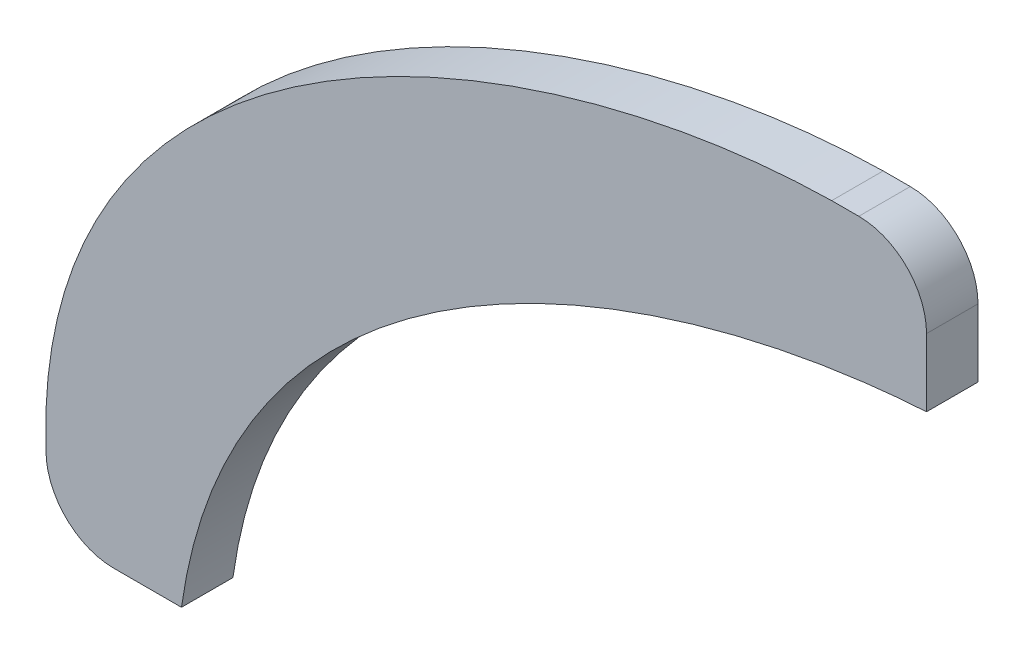
ISO-10303-21;
HEADER;
FILE_DESCRIPTION(('STEP AP214'),'2;1');
FILE_NAME('part.step','',(''),(''),'','','');
FILE_SCHEMA(('AUTOMOTIVE_DESIGN { 1 0 10303 214 1 1 1 1 }'));
ENDSEC;
DATA;
#1=APPLICATION_CONTEXT('core data for automotive mechanical design processes');
#2=APPLICATION_PROTOCOL_DEFINITION('international standard','automotive_design',2000,#1);
#3=PRODUCT_CONTEXT('',#1,'mechanical');
#4=PRODUCT('Part','Part','',(#3));
#5=PRODUCT_RELATED_PRODUCT_CATEGORY('part','',(#4));
#6=PRODUCT_DEFINITION_FORMATION('','',#4);
#7=PRODUCT_DEFINITION_CONTEXT('part definition',#1,'design');
#8=PRODUCT_DEFINITION('design','',#6,#7);
#9=PRODUCT_DEFINITION_SHAPE('','',#8);
#10=(LENGTH_UNIT() NAMED_UNIT(*) SI_UNIT(.MILLI.,.METRE.));
#11=(NAMED_UNIT(*) PLANE_ANGLE_UNIT() SI_UNIT($,.RADIAN.));
#12=(NAMED_UNIT(*) SI_UNIT($,.STERADIAN.) SOLID_ANGLE_UNIT());
#13=UNCERTAINTY_MEASURE_WITH_UNIT(LENGTH_MEASURE(1.E-05),#10,'distance_accuracy_value','');
#14=(GEOMETRIC_REPRESENTATION_CONTEXT(3) GLOBAL_UNCERTAINTY_ASSIGNED_CONTEXT((#13)) GLOBAL_UNIT_ASSIGNED_CONTEXT((#10,
#11,#12)) REPRESENTATION_CONTEXT('',''));
#15=CARTESIAN_POINT('',(0.,0.,0.));
#16=DIRECTION('',(0.,0.,1.));
#17=DIRECTION('',(1.,0.,0.));
#18=AXIS2_PLACEMENT_3D('',#15,#16,#17);
#19=CARTESIAN_POINT('',(0.,0.,4.826));
#20=DIRECTION('',(0.,1.,0.));
#21=DIRECTION('',(0.,0.,1.));
#22=AXIS2_PLACEMENT_3D('',#19,#20,#21);
#23=PLANE('',#22);
#24=DIRECTION('',(1.,0.,0.));
#25=VECTOR('',#24,1.);
#26=CARTESIAN_POINT('',(0.,0.,0.));
#27=LINE('',#26,#25);
#28=CARTESIAN_POINT('',(6.35000000000004,0.,0.));
#29=VERTEX_POINT('',#28);
#30=CARTESIAN_POINT('',(12.7,0.,0.));
#31=VERTEX_POINT('',#30);
#32=EDGE_CURVE('E132',#29,#31,#27,.T.);
#33=ORIENTED_EDGE('',*,*,#32,.T.);
#34=DIRECTION('',(0.,0.,-1.));
#35=VECTOR('',#34,1.);
#36=CARTESIAN_POINT('',(12.7,0.,4.826));
#37=LINE('',#36,#35);
#38=CARTESIAN_POINT('',(12.7,0.,4.826));
#39=VERTEX_POINT('',#38);
#40=EDGE_CURVE('E11',#39,#31,#37,.T.);
#41=ORIENTED_EDGE('',*,*,#40,.F.);
#42=DIRECTION('',(1.,0.,0.));
#43=VECTOR('',#42,1.);
#44=CARTESIAN_POINT('',(0.,0.,4.826));
#45=LINE('',#44,#43);
#46=CARTESIAN_POINT('',(6.35000000000004,0.,4.826));
#47=VERTEX_POINT('',#46);
#48=EDGE_CURVE('E159',#47,#39,#45,.T.);
#49=ORIENTED_EDGE('',*,*,#48,.F.);
#50=DIRECTION('',(0.,0.,-1.));
#51=VECTOR('',#50,1.);
#52=CARTESIAN_POINT('',(6.35000000000004,0.,4.826));
#53=LINE('',#52,#51);
#54=EDGE_CURVE('E125',#47,#29,#53,.T.);
#55=ORIENTED_EDGE('',*,*,#54,.T.);
#56=EDGE_LOOP('',(#33,#41,#49,#55));
#57=FACE_BOUND('',#56,.T.);
#58=ADVANCED_FACE('F35',(#57),#23,.F.);
#59=CARTESIAN_POINT('',(12.7,0.,4.826));
#60=CARTESIAN_POINT('',(17.2634900985718,32.9463909990225,4.826));
#61=CARTESIAN_POINT('',(53.333433175002,49.0331917131884,4.826));
#62=CARTESIAN_POINT('',(82.55,50.8,4.826));
#63=B_SPLINE_CURVE_WITH_KNOTS('',3,(#59,#60,#61,#62),.UNSPECIFIED.,.F.,.F.,(4,4),(0.,1.),.UNSPECIFIED.);
#64=DIRECTION('',(0.,0.,-1.));
#65=VECTOR('',#64,1.);
#66=SURFACE_OF_LINEAR_EXTRUSION('',#63,#65);
#67=CARTESIAN_POINT('',(12.7,0.,0.));
#68=CARTESIAN_POINT('',(17.2634900985718,32.9463909990225,0.));
#69=CARTESIAN_POINT('',(53.333433175002,49.0331917131884,0.));
#70=CARTESIAN_POINT('',(82.55,50.8,0.));
#71=B_SPLINE_CURVE_WITH_KNOTS('',3,(#67,#68,#69,#70),.UNSPECIFIED.,.F.,.F.,(4,4),(0.,1.),.UNSPECIFIED.);
#72=CARTESIAN_POINT('',(82.55,50.8,0.));
#73=VERTEX_POINT('',#72);
#74=EDGE_CURVE('E135',#31,#73,#71,.T.);
#75=ORIENTED_EDGE('',*,*,#74,.T.);
#76=DIRECTION('',(0.,0.,-1.));
#77=VECTOR('',#76,1.);
#78=CARTESIAN_POINT('',(82.55,50.8,4.826));
#79=LINE('',#78,#77);
#80=CARTESIAN_POINT('',(82.55,50.8,4.826));
#81=VERTEX_POINT('',#80);
#82=EDGE_CURVE('E43',#81,#73,#79,.T.);
#83=ORIENTED_EDGE('',*,*,#82,.F.);
#84=EDGE_CURVE('E90',#39,#81,#63,.T.);
#85=ORIENTED_EDGE('',*,*,#84,.F.);
#86=ORIENTED_EDGE('',*,*,#40,.T.);
#87=EDGE_LOOP('',(#75,#83,#85,#86));
#88=FACE_BOUND('',#87,.T.);
#89=ADVANCED_FACE('F194',(#88),#66,.F.);
#90=CARTESIAN_POINT('',(82.55,0.,4.826));
#91=DIRECTION('',(-1.,0.,0.));
#92=DIRECTION('',(0.,0.,1.));
#93=AXIS2_PLACEMENT_3D('',#90,#91,#92);
#94=PLANE('',#93);
#95=DIRECTION('',(0.,1.,0.));
#96=VECTOR('',#95,1.);
#97=CARTESIAN_POINT('',(82.55,0.,0.));
#98=LINE('',#97,#96);
#99=CARTESIAN_POINT('',(82.55,57.15,0.));
#100=VERTEX_POINT('',#99);
#101=EDGE_CURVE('E139',#73,#100,#98,.T.);
#102=ORIENTED_EDGE('',*,*,#101,.T.);
#103=DIRECTION('',(0.,0.,-1.));
#104=VECTOR('',#103,1.);
#105=CARTESIAN_POINT('',(82.55,57.15,4.826));
#106=LINE('',#105,#104);
#107=CARTESIAN_POINT('',(82.55,57.15,4.826));
#108=VERTEX_POINT('',#107);
#109=EDGE_CURVE('E165',#108,#100,#106,.T.);
#110=ORIENTED_EDGE('',*,*,#109,.F.);
#111=DIRECTION('',(0.,1.,0.));
#112=VECTOR('',#111,1.);
#113=CARTESIAN_POINT('',(82.55,0.,4.826));
#114=LINE('',#113,#112);
#115=EDGE_CURVE('E173',#81,#108,#114,.T.);
#116=ORIENTED_EDGE('',*,*,#115,.F.);
#117=ORIENTED_EDGE('',*,*,#82,.T.);
#118=EDGE_LOOP('',(#102,#110,#116,#117));
#119=FACE_BOUND('',#118,.T.);
#120=ADVANCED_FACE('F171',(#119),#94,.F.);
#121=CARTESIAN_POINT('',(76.2,57.15,4.826));
#122=DIRECTION('',(0.,0.,-1.));
#123=DIRECTION('',(-1.,0.,0.));
#124=AXIS2_PLACEMENT_3D('',#121,#122,#123);
#125=CYLINDRICAL_SURFACE('',#124,6.35);
#126=CARTESIAN_POINT('',(76.2,57.15,0.));
#127=DIRECTION('',(0.,0.,1.));
#128=DIRECTION('',(1.,0.,0.));
#129=AXIS2_PLACEMENT_3D('',#126,#127,#128);
#130=CIRCLE('',#129,6.35);
#131=CARTESIAN_POINT('',(76.1999999999999,63.5,0.));
#132=VERTEX_POINT('',#131);
#133=EDGE_CURVE('E144',#100,#132,#130,.T.);
#134=ORIENTED_EDGE('',*,*,#133,.T.);
#135=DIRECTION('',(0.,0.,-1.));
#136=VECTOR('',#135,1.);
#137=CARTESIAN_POINT('',(76.1999999999999,63.5,4.826));
#138=LINE('',#137,#136);
#139=CARTESIAN_POINT('',(76.1999999999999,63.5,4.826));
#140=VERTEX_POINT('',#139);
#141=EDGE_CURVE('E163',#140,#132,#138,.T.);
#142=ORIENTED_EDGE('',*,*,#141,.F.);
#143=CARTESIAN_POINT('',(76.2,57.15,4.826));
#144=DIRECTION('',(0.,0.,1.));
#145=DIRECTION('',(1.,0.,0.));
#146=AXIS2_PLACEMENT_3D('',#143,#144,#145);
#147=CIRCLE('',#146,6.35);
#148=EDGE_CURVE('E183',#108,#140,#147,.T.);
#149=ORIENTED_EDGE('',*,*,#148,.F.);
#150=ORIENTED_EDGE('',*,*,#109,.T.);
#151=EDGE_LOOP('',(#134,#142,#149,#150));
#152=FACE_BOUND('',#151,.T.);
#153=ADVANCED_FACE('F181',(#152),#125,.T.);
#154=CARTESIAN_POINT('',(0.,63.5,4.826));
#155=DIRECTION('',(0.,1.,0.));
#156=DIRECTION('',(0.,0.,1.));
#157=AXIS2_PLACEMENT_3D('',#154,#155,#156);
#158=PLANE('',#157);
#159=DIRECTION('',(1.,0.,0.));
#160=VECTOR('',#159,1.);
#161=CARTESIAN_POINT('',(0.,63.5,0.));
#162=LINE('',#161,#160);
#163=CARTESIAN_POINT('',(73.6604643292017,63.5,0.));
#164=VERTEX_POINT('',#163);
#165=EDGE_CURVE('E147',#164,#132,#162,.T.);
#166=ORIENTED_EDGE('',*,*,#165,.F.);
#167=DIRECTION('',(0.,0.,-1.));
#168=VECTOR('',#167,1.);
#169=CARTESIAN_POINT('',(73.6604643292017,63.5,4.826));
#170=LINE('',#169,#168);
#171=CARTESIAN_POINT('',(73.6604643292017,63.5,4.826));
#172=VERTEX_POINT('',#171);
#173=EDGE_CURVE('E115',#172,#164,#170,.T.);
#174=ORIENTED_EDGE('',*,*,#173,.F.);
#175=DIRECTION('',(1.,0.,0.));
#176=VECTOR('',#175,1.);
#177=CARTESIAN_POINT('',(0.,63.5,4.826));
#178=LINE('',#177,#176);
#179=EDGE_CURVE('E121',#172,#140,#178,.T.);
#180=ORIENTED_EDGE('',*,*,#179,.T.);
#181=ORIENTED_EDGE('',*,*,#141,.T.);
#182=EDGE_LOOP('',(#166,#174,#180,#181));
#183=FACE_BOUND('',#182,.T.);
#184=ADVANCED_FACE('F201',(#183),#158,.T.);
#185=CARTESIAN_POINT('',(0.,6.35,4.826));
#186=CARTESIAN_POINT('',(-1.4342691400351,43.9963135921116,4.826));
#187=CARTESIAN_POINT('',(45.0346469848485,64.0520110727009,4.826));
#188=CARTESIAN_POINT('',(76.2,63.5,4.826));
#189=B_SPLINE_CURVE_WITH_KNOTS('',3,(#185,#186,#187,#188),.UNSPECIFIED.,.F.,.F.,(4,4),(0.,1.),.UNSPECIFIED.);
#190=DIRECTION('',(0.,0.,-1.));
#191=VECTOR('',#190,1.);
#192=SURFACE_OF_LINEAR_EXTRUSION('',#189,#191);
#193=CARTESIAN_POINT('',(0.,6.35,0.));
#194=CARTESIAN_POINT('',(-1.4342691400351,43.9963135921116,0.));
#195=CARTESIAN_POINT('',(45.0346469848485,64.0520110727009,0.));
#196=CARTESIAN_POINT('',(76.2,63.5,0.));
#197=B_SPLINE_CURVE_WITH_KNOTS('',3,(#193,#194,#195,#196),.UNSPECIFIED.,.F.,.F.,(4,4),(0.,1.),.UNSPECIFIED.);
#198=CARTESIAN_POINT('',(0.,9.72856663731306,0.));
#199=VERTEX_POINT('',#198);
#200=EDGE_CURVE('E110',#199,#164,#197,.T.);
#201=ORIENTED_EDGE('',*,*,#200,.F.);
#202=DIRECTION('',(0.,0.,-1.));
#203=VECTOR('',#202,1.);
#204=CARTESIAN_POINT('',(0.,9.72856663731306,4.826));
#205=LINE('',#204,#203);
#206=CARTESIAN_POINT('',(0.,9.72856663731306,4.826));
#207=VERTEX_POINT('',#206);
#208=EDGE_CURVE('E105',#207,#199,#205,.T.);
#209=ORIENTED_EDGE('',*,*,#208,.F.);
#210=EDGE_CURVE('E108',#207,#172,#189,.T.);
#211=ORIENTED_EDGE('',*,*,#210,.T.);
#212=ORIENTED_EDGE('',*,*,#173,.T.);
#213=EDGE_LOOP('',(#201,#209,#211,#212));
#214=FACE_BOUND('',#213,.T.);
#215=ADVANCED_FACE('F107',(#214),#192,.T.);
#216=CARTESIAN_POINT('',(0.,0.,4.826));
#217=DIRECTION('',(-1.,0.,0.));
#218=DIRECTION('',(0.,0.,1.));
#219=AXIS2_PLACEMENT_3D('',#216,#217,#218);
#220=PLANE('',#219);
#221=DIRECTION('',(0.,1.,0.));
#222=VECTOR('',#221,1.);
#223=CARTESIAN_POINT('',(0.,0.,0.));
#224=LINE('',#223,#222);
#225=CARTESIAN_POINT('',(0.,6.35000000000004,0.));
#226=VERTEX_POINT('',#225);
#227=EDGE_CURVE('E153',#226,#199,#224,.T.);
#228=ORIENTED_EDGE('',*,*,#227,.F.);
#229=DIRECTION('',(0.,0.,-1.));
#230=VECTOR('',#229,1.);
#231=CARTESIAN_POINT('',(0.,6.35000000000004,4.826));
#232=LINE('',#231,#230);
#233=CARTESIAN_POINT('',(0.,6.35000000000004,4.826));
#234=VERTEX_POINT('',#233);
#235=EDGE_CURVE('E79',#234,#226,#232,.T.);
#236=ORIENTED_EDGE('',*,*,#235,.F.);
#237=DIRECTION('',(0.,1.,0.));
#238=VECTOR('',#237,1.);
#239=CARTESIAN_POINT('',(0.,0.,4.826));
#240=LINE('',#239,#238);
#241=EDGE_CURVE('E119',#234,#207,#240,.T.);
#242=ORIENTED_EDGE('',*,*,#241,.T.);
#243=ORIENTED_EDGE('',*,*,#208,.T.);
#244=EDGE_LOOP('',(#228,#236,#242,#243));
#245=FACE_BOUND('',#244,.T.);
#246=ADVANCED_FACE('F123',(#245),#220,.T.);
#247=CARTESIAN_POINT('',(6.35,6.35,4.826));
#248=DIRECTION('',(0.,0.,-1.));
#249=DIRECTION('',(-1.,0.,0.));
#250=AXIS2_PLACEMENT_3D('',#247,#248,#249);
#251=CYLINDRICAL_SURFACE('',#250,6.35);
#252=CARTESIAN_POINT('',(6.35,6.35,0.));
#253=DIRECTION('',(0.,0.,1.));
#254=DIRECTION('',(1.,0.,0.));
#255=AXIS2_PLACEMENT_3D('',#252,#253,#254);
#256=CIRCLE('',#255,6.35);
#257=EDGE_CURVE('E82',#226,#29,#256,.T.);
#258=ORIENTED_EDGE('',*,*,#257,.T.);
#259=ORIENTED_EDGE('',*,*,#54,.F.);
#260=CARTESIAN_POINT('',(6.35,6.35,4.826));
#261=DIRECTION('',(0.,0.,1.));
#262=DIRECTION('',(1.,0.,0.));
#263=AXIS2_PLACEMENT_3D('',#260,#261,#262);
#264=CIRCLE('',#263,6.35);
#265=EDGE_CURVE('E51',#234,#47,#264,.T.);
#266=ORIENTED_EDGE('',*,*,#265,.F.);
#267=ORIENTED_EDGE('',*,*,#235,.T.);
#268=EDGE_LOOP('',(#258,#259,#266,#267));
#269=FACE_BOUND('',#268,.T.);
#270=ADVANCED_FACE('F209',(#269),#251,.T.);
#271=CARTESIAN_POINT('',(0.,0.,4.826));
#272=DIRECTION('',(0.,0.,1.));
#273=DIRECTION('',(1.,0.,0.));
#274=AXIS2_PLACEMENT_3D('',#271,#272,#273);
#275=PLANE('',#274);
#276=ORIENTED_EDGE('',*,*,#48,.T.);
#277=ORIENTED_EDGE('',*,*,#84,.T.);
#278=ORIENTED_EDGE('',*,*,#115,.T.);
#279=ORIENTED_EDGE('',*,*,#148,.T.);
#280=ORIENTED_EDGE('',*,*,#179,.F.);
#281=ORIENTED_EDGE('',*,*,#210,.F.);
#282=ORIENTED_EDGE('',*,*,#241,.F.);
#283=ORIENTED_EDGE('',*,*,#265,.T.);
#284=EDGE_LOOP('',(#276,#277,#278,#279,#280,#281,#282,#283));
#285=FACE_BOUND('',#284,.T.);
#286=ADVANCED_FACE('F118',(#285),#275,.T.);
#287=CARTESIAN_POINT('',(0.,0.,0.));
#288=DIRECTION('',(0.,0.,1.));
#289=DIRECTION('',(1.,0.,0.));
#290=AXIS2_PLACEMENT_3D('',#287,#288,#289);
#291=PLANE('',#290);
#292=ORIENTED_EDGE('',*,*,#32,.F.);
#293=ORIENTED_EDGE('',*,*,#257,.F.);
#294=ORIENTED_EDGE('',*,*,#227,.T.);
#295=ORIENTED_EDGE('',*,*,#200,.T.);
#296=ORIENTED_EDGE('',*,*,#165,.T.);
#297=ORIENTED_EDGE('',*,*,#133,.F.);
#298=ORIENTED_EDGE('',*,*,#101,.F.);
#299=ORIENTED_EDGE('',*,*,#74,.F.);
#300=EDGE_LOOP('',(#292,#293,#294,#295,#296,#297,#298,#299));
#301=FACE_BOUND('',#300,.T.);
#302=ADVANCED_FACE('F177',(#301),#291,.F.);
#303=CLOSED_SHELL('',(#58,#89,#120,#153,#184,#215,#246,#270,#286,#302));
#304=MANIFOLD_SOLID_BREP('B2',#303);
#305=ADVANCED_BREP_SHAPE_REPRESENTATION('',(#18,#304),#14);
#306=SHAPE_DEFINITION_REPRESENTATION(#9,#305);
ENDSEC;
END-ISO-10303-21;
